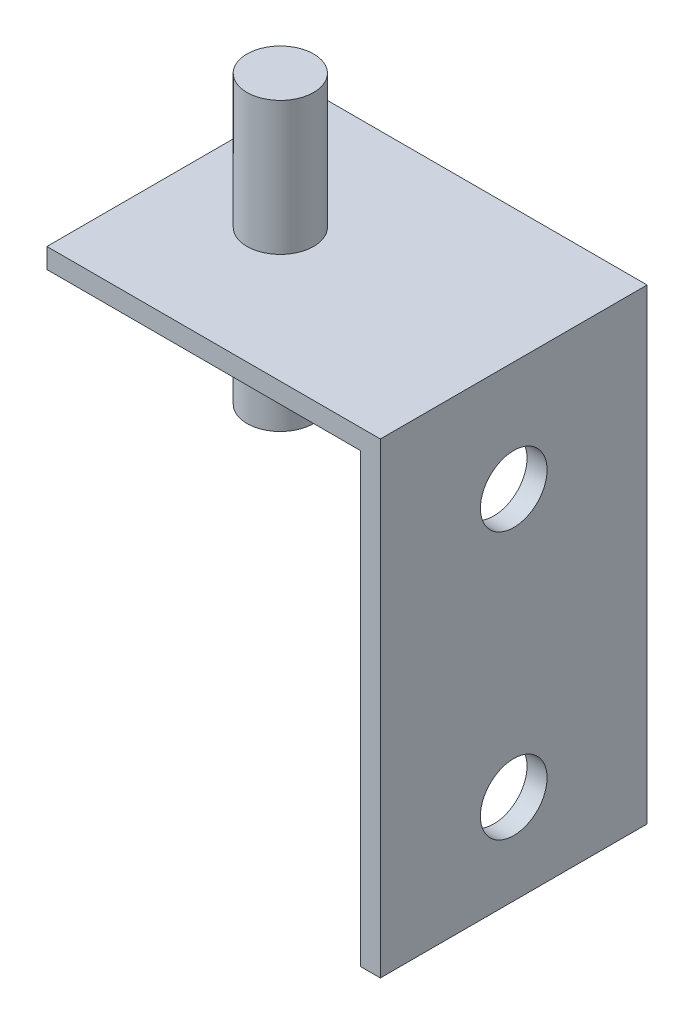
ISO-10303-21;
HEADER;
FILE_DESCRIPTION(('STEP AP214'),'2;1');
FILE_NAME('part.step','',(''),(''),'','','');
FILE_SCHEMA(('AUTOMOTIVE_DESIGN { 1 0 10303 214 1 1 1 1 }'));
ENDSEC;
DATA;
#1=APPLICATION_CONTEXT('core data for automotive mechanical design processes');
#2=APPLICATION_PROTOCOL_DEFINITION('international standard','automotive_design',2000,#1);
#3=PRODUCT_CONTEXT('',#1,'mechanical');
#4=PRODUCT('Part','Part','',(#3));
#5=PRODUCT_RELATED_PRODUCT_CATEGORY('part','',(#4));
#6=PRODUCT_DEFINITION_FORMATION('','',#4);
#7=PRODUCT_DEFINITION_CONTEXT('part definition',#1,'design');
#8=PRODUCT_DEFINITION('design','',#6,#7);
#9=PRODUCT_DEFINITION_SHAPE('','',#8);
#10=(LENGTH_UNIT() NAMED_UNIT(*) SI_UNIT(.MILLI.,.METRE.));
#11=(NAMED_UNIT(*) PLANE_ANGLE_UNIT() SI_UNIT($,.RADIAN.));
#12=(NAMED_UNIT(*) SI_UNIT($,.STERADIAN.) SOLID_ANGLE_UNIT());
#13=UNCERTAINTY_MEASURE_WITH_UNIT(LENGTH_MEASURE(1.E-05),#10,'distance_accuracy_value','');
#14=(GEOMETRIC_REPRESENTATION_CONTEXT(3) GLOBAL_UNCERTAINTY_ASSIGNED_CONTEXT((#13)) GLOBAL_UNIT_ASSIGNED_CONTEXT((#10,
#11,#12)) REPRESENTATION_CONTEXT('',''));
#15=CARTESIAN_POINT('',(0.,0.,0.));
#16=DIRECTION('',(0.,0.,1.));
#17=DIRECTION('',(1.,0.,0.));
#18=AXIS2_PLACEMENT_3D('',#15,#16,#17);
#19=CARTESIAN_POINT('',(0.,0.,0.));
#20=DIRECTION('',(0.,0.,-1.));
#21=DIRECTION('',(-1.,0.,0.));
#22=AXIS2_PLACEMENT_3D('',#19,#20,#21);
#23=PLANE('',#22);
#24=DIRECTION('',(-1.,0.,0.));
#25=VECTOR('',#24,1.);
#26=CARTESIAN_POINT('',(0.,0.,0.));
#27=LINE('',#26,#25);
#28=CARTESIAN_POINT('',(0.,0.,0.));
#29=VERTEX_POINT('',#28);
#30=CARTESIAN_POINT('',(-50.,0.,0.));
#31=VERTEX_POINT('',#30);
#32=EDGE_CURVE('E127',#29,#31,#27,.T.);
#33=ORIENTED_EDGE('',*,*,#32,.F.);
#34=DIRECTION('',(0.,1.,0.));
#35=VECTOR('',#34,1.);
#36=CARTESIAN_POINT('',(0.,0.,0.));
#37=LINE('',#36,#35);
#38=CARTESIAN_POINT('',(0.,-70.,0.));
#39=VERTEX_POINT('',#38);
#40=EDGE_CURVE('E88',#39,#29,#37,.T.);
#41=ORIENTED_EDGE('',*,*,#40,.F.);
#42=DIRECTION('',(1.,0.,0.));
#43=VECTOR('',#42,1.);
#44=CARTESIAN_POINT('',(0.,-70.,0.));
#45=LINE('',#44,#43);
#46=CARTESIAN_POINT('',(-2.99999999999999,-70.,0.));
#47=VERTEX_POINT('',#46);
#48=EDGE_CURVE('E45',#47,#39,#45,.T.);
#49=ORIENTED_EDGE('',*,*,#48,.F.);
#50=DIRECTION('',(0.,1.,0.));
#51=VECTOR('',#50,1.);
#52=CARTESIAN_POINT('',(-3.,0.,0.));
#53=LINE('',#52,#51);
#54=CARTESIAN_POINT('',(-3.,-3.,0.));
#55=VERTEX_POINT('',#54);
#56=EDGE_CURVE('E86',#47,#55,#53,.T.);
#57=ORIENTED_EDGE('',*,*,#56,.T.);
#58=DIRECTION('',(-1.,0.,0.));
#59=VECTOR('',#58,1.);
#60=CARTESIAN_POINT('',(0.,-3.,0.));
#61=LINE('',#60,#59);
#62=CARTESIAN_POINT('',(-50.,-3.00000000000001,0.));
#63=VERTEX_POINT('',#62);
#64=EDGE_CURVE('E111',#55,#63,#61,.T.);
#65=ORIENTED_EDGE('',*,*,#64,.T.);
#66=DIRECTION('',(0.,1.,0.));
#67=VECTOR('',#66,1.);
#68=CARTESIAN_POINT('',(-50.,0.,0.));
#69=LINE('',#68,#67);
#70=EDGE_CURVE('E54',#63,#31,#69,.T.);
#71=ORIENTED_EDGE('',*,*,#70,.T.);
#72=EDGE_LOOP('',(#33,#41,#49,#57,#65,#71));
#73=FACE_BOUND('',#72,.T.);
#74=ADVANCED_FACE('F35',(#73),#23,.T.);
#75=CARTESIAN_POINT('',(-50.,0.,0.));
#76=DIRECTION('',(-1.,0.,0.));
#77=DIRECTION('',(0.,0.,1.));
#78=AXIS2_PLACEMENT_3D('',#75,#76,#77);
#79=PLANE('',#78);
#80=ORIENTED_EDGE('',*,*,#70,.F.);
#81=DIRECTION('',(0.,0.,1.));
#82=VECTOR('',#81,1.);
#83=CARTESIAN_POINT('',(-50.,-3.00000000000001,0.));
#84=LINE('',#83,#82);
#85=CARTESIAN_POINT('',(-50.,-3.00000000000001,40.));
#86=VERTEX_POINT('',#85);
#87=EDGE_CURVE('E137',#63,#86,#84,.T.);
#88=ORIENTED_EDGE('',*,*,#87,.T.);
#89=DIRECTION('',(0.,1.,0.));
#90=VECTOR('',#89,1.);
#91=CARTESIAN_POINT('',(-50.,0.,40.));
#92=LINE('',#91,#90);
#93=CARTESIAN_POINT('',(-50.,0.,40.));
#94=VERTEX_POINT('',#93);
#95=EDGE_CURVE('E114',#86,#94,#92,.T.);
#96=ORIENTED_EDGE('',*,*,#95,.T.);
#97=DIRECTION('',(0.,0.,1.));
#98=VECTOR('',#97,1.);
#99=CARTESIAN_POINT('',(-50.,0.,0.));
#100=LINE('',#99,#98);
#101=EDGE_CURVE('E130',#31,#94,#100,.T.);
#102=ORIENTED_EDGE('',*,*,#101,.F.);
#103=EDGE_LOOP('',(#80,#88,#96,#102));
#104=FACE_BOUND('',#103,.T.);
#105=ADVANCED_FACE('F147',(#104),#79,.T.);
#106=CARTESIAN_POINT('',(0.,0.,40.));
#107=DIRECTION('',(0.,0.,-1.));
#108=DIRECTION('',(0.,1.,0.));
#109=AXIS2_PLACEMENT_3D('',#106,#107,#108);
#110=PLANE('',#109);
#111=DIRECTION('',(0.,1.,0.));
#112=VECTOR('',#111,1.);
#113=CARTESIAN_POINT('',(0.,0.,40.));
#114=LINE('',#113,#112);
#115=CARTESIAN_POINT('',(0.,-70.,40.));
#116=VERTEX_POINT('',#115);
#117=CARTESIAN_POINT('',(0.,0.,40.));
#118=VERTEX_POINT('',#117);
#119=EDGE_CURVE('E124',#116,#118,#114,.T.);
#120=ORIENTED_EDGE('',*,*,#119,.T.);
#121=DIRECTION('',(-1.,0.,0.));
#122=VECTOR('',#121,1.);
#123=CARTESIAN_POINT('',(0.,0.,40.));
#124=LINE('',#123,#122);
#125=EDGE_CURVE('E105',#118,#94,#124,.T.);
#126=ORIENTED_EDGE('',*,*,#125,.T.);
#127=ORIENTED_EDGE('',*,*,#95,.F.);
#128=DIRECTION('',(-1.,0.,0.));
#129=VECTOR('',#128,1.);
#130=CARTESIAN_POINT('',(0.,-3.,40.));
#131=LINE('',#130,#129);
#132=CARTESIAN_POINT('',(-3.,-3.,40.));
#133=VERTEX_POINT('',#132);
#134=EDGE_CURVE('E135',#133,#86,#131,.T.);
#135=ORIENTED_EDGE('',*,*,#134,.F.);
#136=DIRECTION('',(0.,1.,0.));
#137=VECTOR('',#136,1.);
#138=CARTESIAN_POINT('',(-3.,0.,40.));
#139=LINE('',#138,#137);
#140=CARTESIAN_POINT('',(-2.99999999999999,-70.,40.));
#141=VERTEX_POINT('',#140);
#142=EDGE_CURVE('E100',#141,#133,#139,.T.);
#143=ORIENTED_EDGE('',*,*,#142,.F.);
#144=DIRECTION('',(1.,0.,0.));
#145=VECTOR('',#144,1.);
#146=CARTESIAN_POINT('',(0.,-70.,40.));
#147=LINE('',#146,#145);
#148=EDGE_CURVE('E96',#141,#116,#147,.T.);
#149=ORIENTED_EDGE('',*,*,#148,.T.);
#150=EDGE_LOOP('',(#120,#126,#127,#135,#143,#149));
#151=FACE_BOUND('',#150,.T.);
#152=ADVANCED_FACE('F145',(#151),#110,.F.);
#153=CARTESIAN_POINT('',(0.,-70.,0.));
#154=DIRECTION('',(0.,1.,0.));
#155=DIRECTION('',(0.,0.,1.));
#156=AXIS2_PLACEMENT_3D('',#153,#154,#155);
#157=PLANE('',#156);
#158=DIRECTION('',(0.,0.,1.));
#159=VECTOR('',#158,1.);
#160=CARTESIAN_POINT('',(-2.99999999999999,-70.,0.));
#161=LINE('',#160,#159);
#162=EDGE_CURVE('E95',#47,#141,#161,.T.);
#163=ORIENTED_EDGE('',*,*,#162,.F.);
#164=ORIENTED_EDGE('',*,*,#48,.T.);
#165=DIRECTION('',(0.,0.,1.));
#166=VECTOR('',#165,1.);
#167=CARTESIAN_POINT('',(0.,-70.,0.));
#168=LINE('',#167,#166);
#169=EDGE_CURVE('E119',#39,#116,#168,.T.);
#170=ORIENTED_EDGE('',*,*,#169,.T.);
#171=ORIENTED_EDGE('',*,*,#148,.F.);
#172=EDGE_LOOP('',(#163,#164,#170,#171));
#173=FACE_BOUND('',#172,.T.);
#174=ADVANCED_FACE('F37',(#173),#157,.F.);
#175=CARTESIAN_POINT('',(0.,0.,0.));
#176=DIRECTION('',(1.,0.,0.));
#177=DIRECTION('',(0.,1.,0.));
#178=AXIS2_PLACEMENT_3D('',#175,#176,#177);
#179=PLANE('',#178);
#180=CARTESIAN_POINT('',(0.,-16.5,20.));
#181=DIRECTION('',(1.,0.,0.));
#182=DIRECTION('',(0.,1.,0.));
#183=AXIS2_PLACEMENT_3D('',#180,#181,#182);
#184=CIRCLE('',#183,5.);
#185=CARTESIAN_POINT('',(0.,-11.5,20.));
#186=VERTEX_POINT('',#185);
#187=EDGE_CURVE('E187',#186,#186,#184,.T.);
#188=ORIENTED_EDGE('',*,*,#187,.F.);
#189=EDGE_LOOP('',(#188));
#190=FACE_BOUND('',#189,.T.);
#191=CARTESIAN_POINT('',(0.,-56.5,20.));
#192=DIRECTION('',(1.,0.,0.));
#193=DIRECTION('',(0.,1.,0.));
#194=AXIS2_PLACEMENT_3D('',#191,#192,#193);
#195=CIRCLE('',#194,5.);
#196=CARTESIAN_POINT('',(0.,-51.5,20.));
#197=VERTEX_POINT('',#196);
#198=EDGE_CURVE('E186',#197,#197,#195,.T.);
#199=ORIENTED_EDGE('',*,*,#198,.F.);
#200=EDGE_LOOP('',(#199));
#201=FACE_BOUND('',#200,.T.);
#202=ORIENTED_EDGE('',*,*,#119,.F.);
#203=ORIENTED_EDGE('',*,*,#169,.F.);
#204=ORIENTED_EDGE('',*,*,#40,.T.);
#205=DIRECTION('',(0.,0.,1.));
#206=VECTOR('',#205,1.);
#207=CARTESIAN_POINT('',(0.,0.,0.));
#208=LINE('',#207,#206);
#209=EDGE_CURVE('E108',#29,#118,#208,.T.);
#210=ORIENTED_EDGE('',*,*,#209,.T.);
#211=EDGE_LOOP('',(#202,#203,#204,#210));
#212=FACE_BOUND('',#211,.T.);
#213=ADVANCED_FACE('F150',(#190,#201,#212),#179,.T.);
#214=CARTESIAN_POINT('',(0.,0.,0.));
#215=DIRECTION('',(0.,1.,0.));
#216=DIRECTION('',(-1.,0.,0.));
#217=AXIS2_PLACEMENT_3D('',#214,#215,#216);
#218=PLANE('',#217);
#219=CARTESIAN_POINT('',(-35.,0.,20.));
#220=DIRECTION('',(0.,1.,0.));
#221=DIRECTION('',(-1.,0.,0.));
#222=AXIS2_PLACEMENT_3D('',#219,#220,#221);
#223=CIRCLE('',#222,5.);
#224=CARTESIAN_POINT('',(-40.,0.,20.));
#225=VERTEX_POINT('',#224);
#226=EDGE_CURVE('E11',#225,#225,#223,.T.);
#227=ORIENTED_EDGE('',*,*,#226,.F.);
#228=EDGE_LOOP('',(#227));
#229=FACE_BOUND('',#228,.T.);
#230=ORIENTED_EDGE('',*,*,#125,.F.);
#231=ORIENTED_EDGE('',*,*,#209,.F.);
#232=ORIENTED_EDGE('',*,*,#32,.T.);
#233=ORIENTED_EDGE('',*,*,#101,.T.);
#234=EDGE_LOOP('',(#230,#231,#232,#233));
#235=FACE_BOUND('',#234,.T.);
#236=ADVANCED_FACE('F149',(#229,#235),#218,.T.);
#237=CARTESIAN_POINT('',(-3.,0.,0.));
#238=DIRECTION('',(1.,0.,0.));
#239=DIRECTION('',(0.,1.,0.));
#240=AXIS2_PLACEMENT_3D('',#237,#238,#239);
#241=PLANE('',#240);
#242=CARTESIAN_POINT('',(-3.,-16.5,20.));
#243=DIRECTION('',(-1.,0.,0.));
#244=DIRECTION('',(0.,1.,0.));
#245=AXIS2_PLACEMENT_3D('',#242,#243,#244);
#246=CIRCLE('',#245,5.);
#247=CARTESIAN_POINT('',(-3.,-11.5,20.));
#248=VERTEX_POINT('',#247);
#249=EDGE_CURVE('E181',#248,#248,#246,.T.);
#250=ORIENTED_EDGE('',*,*,#249,.F.);
#251=EDGE_LOOP('',(#250));
#252=FACE_BOUND('',#251,.T.);
#253=CARTESIAN_POINT('',(-2.99999999999999,-56.5,20.));
#254=DIRECTION('',(-1.,0.,0.));
#255=DIRECTION('',(0.,-1.,0.));
#256=AXIS2_PLACEMENT_3D('',#253,#254,#255);
#257=CIRCLE('',#256,5.);
#258=CARTESIAN_POINT('',(-2.99999999999999,-61.5,20.));
#259=VERTEX_POINT('',#258);
#260=EDGE_CURVE('E184',#259,#259,#257,.T.);
#261=ORIENTED_EDGE('',*,*,#260,.F.);
#262=EDGE_LOOP('',(#261));
#263=FACE_BOUND('',#262,.T.);
#264=ORIENTED_EDGE('',*,*,#142,.T.);
#265=DIRECTION('',(0.,0.,1.));
#266=VECTOR('',#265,1.);
#267=CARTESIAN_POINT('',(-3.,-3.,0.));
#268=LINE('',#267,#266);
#269=EDGE_CURVE('E103',#55,#133,#268,.T.);
#270=ORIENTED_EDGE('',*,*,#269,.F.);
#271=ORIENTED_EDGE('',*,*,#56,.F.);
#272=ORIENTED_EDGE('',*,*,#162,.T.);
#273=EDGE_LOOP('',(#264,#270,#271,#272));
#274=FACE_BOUND('',#273,.T.);
#275=ADVANCED_FACE('F102',(#252,#263,#274),#241,.F.);
#276=CARTESIAN_POINT('',(0.,-3.,0.));
#277=DIRECTION('',(0.,1.,0.));
#278=DIRECTION('',(-1.,0.,0.));
#279=AXIS2_PLACEMENT_3D('',#276,#277,#278);
#280=PLANE('',#279);
#281=CARTESIAN_POINT('',(-35.,-3.,20.));
#282=DIRECTION('',(0.,1.,0.));
#283=DIRECTION('',(-1.,0.,0.));
#284=AXIS2_PLACEMENT_3D('',#281,#282,#283);
#285=CIRCLE('',#284,5.);
#286=CARTESIAN_POINT('',(-40.,-3.,20.));
#287=VERTEX_POINT('',#286);
#288=EDGE_CURVE('E39',#287,#287,#285,.T.);
#289=ORIENTED_EDGE('',*,*,#288,.T.);
#290=EDGE_LOOP('',(#289));
#291=FACE_BOUND('',#290,.T.);
#292=ORIENTED_EDGE('',*,*,#134,.T.);
#293=ORIENTED_EDGE('',*,*,#87,.F.);
#294=ORIENTED_EDGE('',*,*,#64,.F.);
#295=ORIENTED_EDGE('',*,*,#269,.T.);
#296=EDGE_LOOP('',(#292,#293,#294,#295));
#297=FACE_BOUND('',#296,.T.);
#298=ADVANCED_FACE('F143',(#291,#297),#280,.F.);
#299=CARTESIAN_POINT('',(-35.,-23.,20.));
#300=DIRECTION('',(0.,1.,0.));
#301=DIRECTION('',(-1.,0.,0.));
#302=AXIS2_PLACEMENT_3D('',#299,#300,#301);
#303=PLANE('',#302);
#304=CARTESIAN_POINT('',(-35.,-23.,20.));
#305=DIRECTION('',(0.,1.,0.));
#306=DIRECTION('',(-1.,0.,0.));
#307=AXIS2_PLACEMENT_3D('',#304,#305,#306);
#308=CIRCLE('',#307,5.);
#309=CARTESIAN_POINT('',(-40.,-23.,20.));
#310=VERTEX_POINT('',#309);
#311=EDGE_CURVE('E198',#310,#310,#308,.T.);
#312=ORIENTED_EDGE('',*,*,#311,.F.);
#313=EDGE_LOOP('',(#312));
#314=FACE_BOUND('',#313,.T.);
#315=ADVANCED_FACE('F172',(#314),#303,.F.);
#316=CARTESIAN_POINT('',(-35.,-23.,20.));
#317=DIRECTION('',(0.,1.,0.));
#318=DIRECTION('',(-1.,0.,0.));
#319=AXIS2_PLACEMENT_3D('',#316,#317,#318);
#320=CYLINDRICAL_SURFACE('',#319,5.);
#321=ORIENTED_EDGE('',*,*,#311,.T.);
#322=EDGE_LOOP('',(#321));
#323=FACE_BOUND('',#322,.T.);
#324=ORIENTED_EDGE('',*,*,#288,.F.);
#325=EDGE_LOOP('',(#324));
#326=FACE_BOUND('',#325,.T.);
#327=ADVANCED_FACE('F205',(#323,#326),#320,.T.);
#328=ORIENTED_EDGE('',*,*,#226,.T.);
#329=EDGE_LOOP('',(#328));
#330=FACE_BOUND('',#329,.T.);
#331=CARTESIAN_POINT('',(-35.,20.,20.));
#332=DIRECTION('',(0.,1.,0.));
#333=DIRECTION('',(-1.,0.,0.));
#334=AXIS2_PLACEMENT_3D('',#331,#332,#333);
#335=CIRCLE('',#334,5.);
#336=CARTESIAN_POINT('',(-40.,20.,20.));
#337=VERTEX_POINT('',#336);
#338=EDGE_CURVE('E190',#337,#337,#335,.T.);
#339=ORIENTED_EDGE('',*,*,#338,.F.);
#340=EDGE_LOOP('',(#339));
#341=FACE_BOUND('',#340,.T.);
#342=ADVANCED_FACE('F207',(#330,#341),#320,.T.);
#343=CARTESIAN_POINT('',(-35.,20.,20.));
#344=DIRECTION('',(0.,1.,0.));
#345=DIRECTION('',(-1.,0.,0.));
#346=AXIS2_PLACEMENT_3D('',#343,#344,#345);
#347=PLANE('',#346);
#348=ORIENTED_EDGE('',*,*,#338,.T.);
#349=EDGE_LOOP('',(#348));
#350=FACE_BOUND('',#349,.T.);
#351=ADVANCED_FACE('F213',(#350),#347,.T.);
#352=CARTESIAN_POINT('',(17.,-56.5,20.));
#353=DIRECTION('',(-1.,0.,0.));
#354=DIRECTION('',(0.,-1.,0.));
#355=AXIS2_PLACEMENT_3D('',#352,#353,#354);
#356=CYLINDRICAL_SURFACE('',#355,5.);
#357=ORIENTED_EDGE('',*,*,#198,.T.);
#358=EDGE_LOOP('',(#357));
#359=FACE_BOUND('',#358,.T.);
#360=ORIENTED_EDGE('',*,*,#260,.T.);
#361=EDGE_LOOP('',(#360));
#362=FACE_BOUND('',#361,.T.);
#363=ADVANCED_FACE('F220',(#359,#362),#356,.F.);
#364=CARTESIAN_POINT('',(17.,-16.5,20.));
#365=DIRECTION('',(-1.,0.,0.));
#366=DIRECTION('',(0.,-1.,0.));
#367=AXIS2_PLACEMENT_3D('',#364,#365,#366);
#368=CYLINDRICAL_SURFACE('',#367,5.);
#369=ORIENTED_EDGE('',*,*,#187,.T.);
#370=EDGE_LOOP('',(#369));
#371=FACE_BOUND('',#370,.T.);
#372=ORIENTED_EDGE('',*,*,#249,.T.);
#373=EDGE_LOOP('',(#372));
#374=FACE_BOUND('',#373,.T.);
#375=ADVANCED_FACE('F224',(#371,#374),#368,.F.);
#376=CLOSED_SHELL('',(#74,#105,#152,#174,#213,#236,#275,#298,#315,#327,#342,#351,#363,#375));
#377=MANIFOLD_SOLID_BREP('B2',#376);
#378=ADVANCED_BREP_SHAPE_REPRESENTATION('',(#18,#377),#14);
#379=SHAPE_DEFINITION_REPRESENTATION(#9,#378);
ENDSEC;
END-ISO-10303-21;
